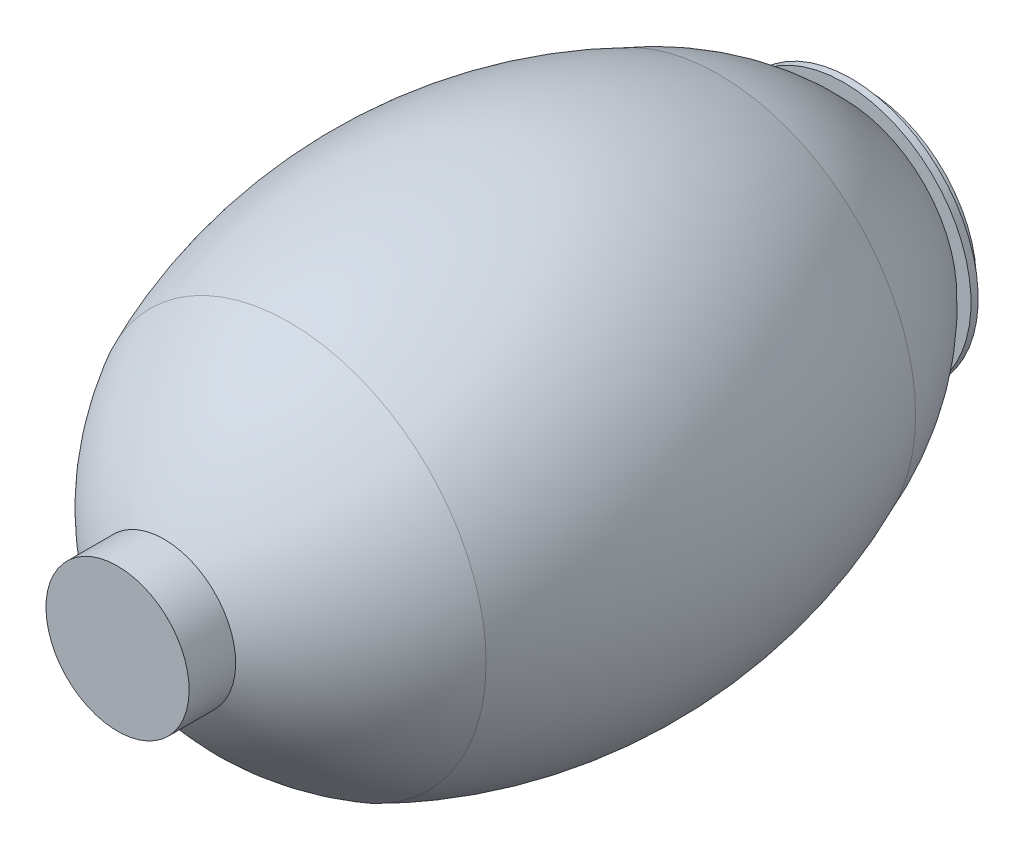
ISO-10303-21;
HEADER;
FILE_DESCRIPTION(('STEP AP214'),'2;1');
FILE_NAME('part.step','',(''),(''),'','','');
FILE_SCHEMA(('AUTOMOTIVE_DESIGN { 1 0 10303 214 1 1 1 1 }'));
ENDSEC;
DATA;
#1=APPLICATION_CONTEXT('core data for automotive mechanical design processes');
#2=APPLICATION_PROTOCOL_DEFINITION('international standard','automotive_design',2000,#1);
#3=PRODUCT_CONTEXT('',#1,'mechanical');
#4=PRODUCT('Part','Part','',(#3));
#5=PRODUCT_RELATED_PRODUCT_CATEGORY('part','',(#4));
#6=PRODUCT_DEFINITION_FORMATION('','',#4);
#7=PRODUCT_DEFINITION_CONTEXT('part definition',#1,'design');
#8=PRODUCT_DEFINITION('design','',#6,#7);
#9=PRODUCT_DEFINITION_SHAPE('','',#8);
#10=(LENGTH_UNIT() NAMED_UNIT(*) SI_UNIT(.MILLI.,.METRE.));
#11=(NAMED_UNIT(*) PLANE_ANGLE_UNIT() SI_UNIT($,.RADIAN.));
#12=(NAMED_UNIT(*) SI_UNIT($,.STERADIAN.) SOLID_ANGLE_UNIT());
#13=UNCERTAINTY_MEASURE_WITH_UNIT(LENGTH_MEASURE(1.E-05),#10,'distance_accuracy_value','');
#14=(GEOMETRIC_REPRESENTATION_CONTEXT(3) GLOBAL_UNCERTAINTY_ASSIGNED_CONTEXT((#13)) GLOBAL_UNIT_ASSIGNED_CONTEXT((#10,
#11,#12)) REPRESENTATION_CONTEXT('',''));
#15=CARTESIAN_POINT('',(0.,0.,0.));
#16=DIRECTION('',(0.,0.,1.));
#17=DIRECTION('',(1.,0.,0.));
#18=AXIS2_PLACEMENT_3D('',#15,#16,#17);
#19=CARTESIAN_POINT('',(0.,0.,0.));
#20=DIRECTION('',(0.,0.,-1.));
#21=DIRECTION('',(0.,1.,0.));
#22=AXIS2_PLACEMENT_3D('',#19,#20,#21);
#23=PLANE('',#22);
#24=CARTESIAN_POINT('',(0.,0.,0.));
#25=DIRECTION('',(0.,0.,-1.));
#26=DIRECTION('',(0.,1.,0.));
#27=AXIS2_PLACEMENT_3D('',#24,#25,#26);
#28=CIRCLE('',#27,20.);
#29=CARTESIAN_POINT('',(0.,20.,0.));
#30=VERTEX_POINT('',#29);
#31=EDGE_CURVE('E48',#30,#30,#28,.T.);
#32=ORIENTED_EDGE('',*,*,#31,.F.);
#33=EDGE_LOOP('',(#32));
#34=FACE_BOUND('',#33,.T.);
#35=ADVANCED_FACE('F33',(#34),#23,.F.);
#36=CARTESIAN_POINT('',(0.,0.,-209.));
#37=DIRECTION('',(0.,0.,-1.));
#38=DIRECTION('',(0.,1.,0.));
#39=AXIS2_PLACEMENT_3D('',#36,#37,#38);
#40=CYLINDRICAL_SURFACE('',#39,20.);
#41=CARTESIAN_POINT('',(0.,0.,-13.));
#42=DIRECTION('',(0.,0.,-1.));
#43=DIRECTION('',(0.,1.,0.));
#44=AXIS2_PLACEMENT_3D('',#41,#42,#43);
#45=CIRCLE('',#44,20.);
#46=CARTESIAN_POINT('',(0.,20.,-13.));
#47=VERTEX_POINT('',#46);
#48=EDGE_CURVE('E44',#47,#47,#45,.T.);
#49=ORIENTED_EDGE('',*,*,#48,.F.);
#50=EDGE_LOOP('',(#49));
#51=FACE_BOUND('',#50,.T.);
#52=ORIENTED_EDGE('',*,*,#31,.T.);
#53=EDGE_LOOP('',(#52));
#54=FACE_BOUND('',#53,.T.);
#55=ADVANCED_FACE('F101',(#51,#54),#40,.T.);
#56=CARTESIAN_POINT('',(0.,0.,-91.686191252602));
#57=DIRECTION('',(0.,0.,-1.));
#58=DIRECTION('',(0.,1.,0.));
#59=AXIS2_PLACEMENT_3D('',#56,#57,#58);
#60=DEGENERATE_TOROIDAL_SURFACE('',#59,23.6861912526021,90.,.F.);
#61=CARTESIAN_POINT('',(0.,0.,-48.));
#62=DIRECTION('',(0.,0.,-1.));
#63=DIRECTION('',(0.,1.,0.));
#64=AXIS2_PLACEMENT_3D('',#61,#62,#63);
#65=CIRCLE('',#64,55.);
#66=CARTESIAN_POINT('',(0.,55.,-48.));
#67=VERTEX_POINT('',#66);
#68=EDGE_CURVE('E40',#67,#67,#65,.T.);
#69=ORIENTED_EDGE('',*,*,#68,.F.);
#70=EDGE_LOOP('',(#69));
#71=FACE_BOUND('',#70,.T.);
#72=ORIENTED_EDGE('',*,*,#48,.T.);
#73=EDGE_LOOP('',(#72));
#74=FACE_BOUND('',#73,.T.);
#75=ADVANCED_FACE('F90',(#71,#74),#60,.F.);
#76=CARTESIAN_POINT('',(0.,0.,-108.));
#77=DIRECTION('',(0.,0.,-1.));
#78=DIRECTION('',(0.,1.,0.));
#79=AXIS2_PLACEMENT_3D('',#76,#77,#78);
#80=DEGENERATE_TOROIDAL_SURFACE('',#79,82.75,150.25,.F.);
#81=CARTESIAN_POINT('',(0.,0.,-168.));
#82=DIRECTION('',(0.,0.,-1.));
#83=DIRECTION('',(0.,1.,0.));
#84=AXIS2_PLACEMENT_3D('',#81,#82,#83);
#85=CIRCLE('',#84,55.);
#86=CARTESIAN_POINT('',(0.,55.,-168.));
#87=VERTEX_POINT('',#86);
#88=EDGE_CURVE('E10',#87,#87,#85,.T.);
#89=ORIENTED_EDGE('',*,*,#88,.F.);
#90=EDGE_LOOP('',(#89));
#91=FACE_BOUND('',#90,.T.);
#92=ORIENTED_EDGE('',*,*,#68,.T.);
#93=EDGE_LOOP('',(#92));
#94=FACE_BOUND('',#93,.T.);
#95=ADVANCED_FACE('F84',(#91,#94),#80,.F.);
#96=CARTESIAN_POINT('',(0.,0.,-203.));
#97=DIRECTION('',(0.,0.,-1.));
#98=DIRECTION('',(0.,1.,0.));
#99=AXIS2_PLACEMENT_3D('',#96,#97,#98);
#100=PLANE('',#99);
#101=CARTESIAN_POINT('',(0.,0.,-203.));
#102=DIRECTION('',(0.,0.,-1.));
#103=DIRECTION('',(0.,1.,0.));
#104=AXIS2_PLACEMENT_3D('',#101,#102,#103);
#105=CIRCLE('',#104,35.5);
#106=CARTESIAN_POINT('',(0.,35.5,-203.));
#107=VERTEX_POINT('',#106);
#108=EDGE_CURVE('E62',#107,#107,#105,.T.);
#109=ORIENTED_EDGE('',*,*,#108,.F.);
#110=EDGE_LOOP('',(#109));
#111=FACE_BOUND('',#110,.T.);
#112=CARTESIAN_POINT('',(0.,0.,-203.));
#113=DIRECTION('',(0.,0.,-1.));
#114=DIRECTION('',(0.,1.,0.));
#115=AXIS2_PLACEMENT_3D('',#112,#113,#114);
#116=CIRCLE('',#115,31.5);
#117=CARTESIAN_POINT('',(0.,31.5,-203.));
#118=VERTEX_POINT('',#117);
#119=EDGE_CURVE('E65',#118,#118,#116,.T.);
#120=ORIENTED_EDGE('',*,*,#119,.T.);
#121=EDGE_LOOP('',(#120));
#122=FACE_BOUND('',#121,.T.);
#123=ADVANCED_FACE('F69',(#111,#122),#100,.F.);
#124=CARTESIAN_POINT('',(0.,0.,-209.));
#125=DIRECTION('',(0.,0.,-1.));
#126=DIRECTION('',(0.,1.,0.));
#127=AXIS2_PLACEMENT_3D('',#124,#125,#126);
#128=CYLINDRICAL_SURFACE('',#127,35.5);
#129=CARTESIAN_POINT('',(0.,0.,-205.));
#130=DIRECTION('',(0.,0.,-1.));
#131=DIRECTION('',(0.,1.,0.));
#132=AXIS2_PLACEMENT_3D('',#129,#130,#131);
#133=CIRCLE('',#132,35.5);
#134=CARTESIAN_POINT('',(0.,35.5,-205.));
#135=VERTEX_POINT('',#134);
#136=EDGE_CURVE('E59',#135,#135,#133,.T.);
#137=ORIENTED_EDGE('',*,*,#136,.F.);
#138=EDGE_LOOP('',(#137));
#139=FACE_BOUND('',#138,.T.);
#140=ORIENTED_EDGE('',*,*,#108,.T.);
#141=EDGE_LOOP('',(#140));
#142=FACE_BOUND('',#141,.T.);
#143=ADVANCED_FACE('F73',(#139,#142),#128,.T.);
#144=CARTESIAN_POINT('',(0.,0.,-136.726300345806));
#145=DIRECTION('',(0.,0.,-1.));
#146=DIRECTION('',(0.,1.,0.));
#147=AXIS2_PLACEMENT_3D('',#144,#145,#146);
#148=DEGENERATE_TOROIDAL_SURFACE('',#147,29.3916803360335,90.,.F.);
#149=ORIENTED_EDGE('',*,*,#119,.F.);
#150=EDGE_LOOP('',(#149));
#151=FACE_BOUND('',#150,.T.);
#152=ORIENTED_EDGE('',*,*,#88,.T.);
#153=EDGE_LOOP('',(#152));
#154=FACE_BOUND('',#153,.T.);
#155=ADVANCED_FACE('F35',(#151,#154),#148,.F.);
#156=CARTESIAN_POINT('',(0.,0.,-205.));
#157=DIRECTION('',(0.,0.,1.));
#158=DIRECTION('',(0.,-1.,0.));
#159=AXIS2_PLACEMENT_3D('',#156,#157,#158);
#160=PLANE('',#159);
#161=CARTESIAN_POINT('',(0.,0.,-205.));
#162=DIRECTION('',(0.,0.,-1.));
#163=DIRECTION('',(0.,1.,0.));
#164=AXIS2_PLACEMENT_3D('',#161,#162,#163);
#165=CIRCLE('',#164,31.);
#166=CARTESIAN_POINT('',(0.,31.,-205.));
#167=VERTEX_POINT('',#166);
#168=EDGE_CURVE('E56',#167,#167,#165,.T.);
#169=ORIENTED_EDGE('',*,*,#168,.F.);
#170=EDGE_LOOP('',(#169));
#171=FACE_BOUND('',#170,.T.);
#172=ORIENTED_EDGE('',*,*,#136,.T.);
#173=EDGE_LOOP('',(#172));
#174=FACE_BOUND('',#173,.T.);
#175=ADVANCED_FACE('F72',(#171,#174),#160,.F.);
#176=CARTESIAN_POINT('',(0.,0.,-209.));
#177=DIRECTION('',(0.,0.,-1.));
#178=DIRECTION('',(0.,1.,0.));
#179=AXIS2_PLACEMENT_3D('',#176,#177,#178);
#180=CYLINDRICAL_SURFACE('',#179,31.);
#181=CARTESIAN_POINT('',(0.,0.,-209.));
#182=DIRECTION('',(0.,0.,-1.));
#183=DIRECTION('',(0.,1.,0.));
#184=AXIS2_PLACEMENT_3D('',#181,#182,#183);
#185=CIRCLE('',#184,31.);
#186=CARTESIAN_POINT('',(0.,31.,-209.));
#187=VERTEX_POINT('',#186);
#188=EDGE_CURVE('E53',#187,#187,#185,.T.);
#189=ORIENTED_EDGE('',*,*,#188,.F.);
#190=EDGE_LOOP('',(#189));
#191=FACE_BOUND('',#190,.T.);
#192=ORIENTED_EDGE('',*,*,#168,.T.);
#193=EDGE_LOOP('',(#192));
#194=FACE_BOUND('',#193,.T.);
#195=ADVANCED_FACE('F78',(#191,#194),#180,.T.);
#196=CARTESIAN_POINT('',(0.,0.,-209.));
#197=DIRECTION('',(0.,0.,1.));
#198=DIRECTION('',(0.,-1.,0.));
#199=AXIS2_PLACEMENT_3D('',#196,#197,#198);
#200=PLANE('',#199);
#201=ORIENTED_EDGE('',*,*,#188,.T.);
#202=EDGE_LOOP('',(#201));
#203=FACE_BOUND('',#202,.T.);
#204=ADVANCED_FACE('F96',(#203),#200,.F.);
#205=CLOSED_SHELL('',(#35,#55,#75,#95,#123,#143,#155,#175,#195,#204));
#206=MANIFOLD_SOLID_BREP('B2',#205);
#207=ADVANCED_BREP_SHAPE_REPRESENTATION('',(#18,#206),#14);
#208=SHAPE_DEFINITION_REPRESENTATION(#9,#207);
ENDSEC;
END-ISO-10303-21;
